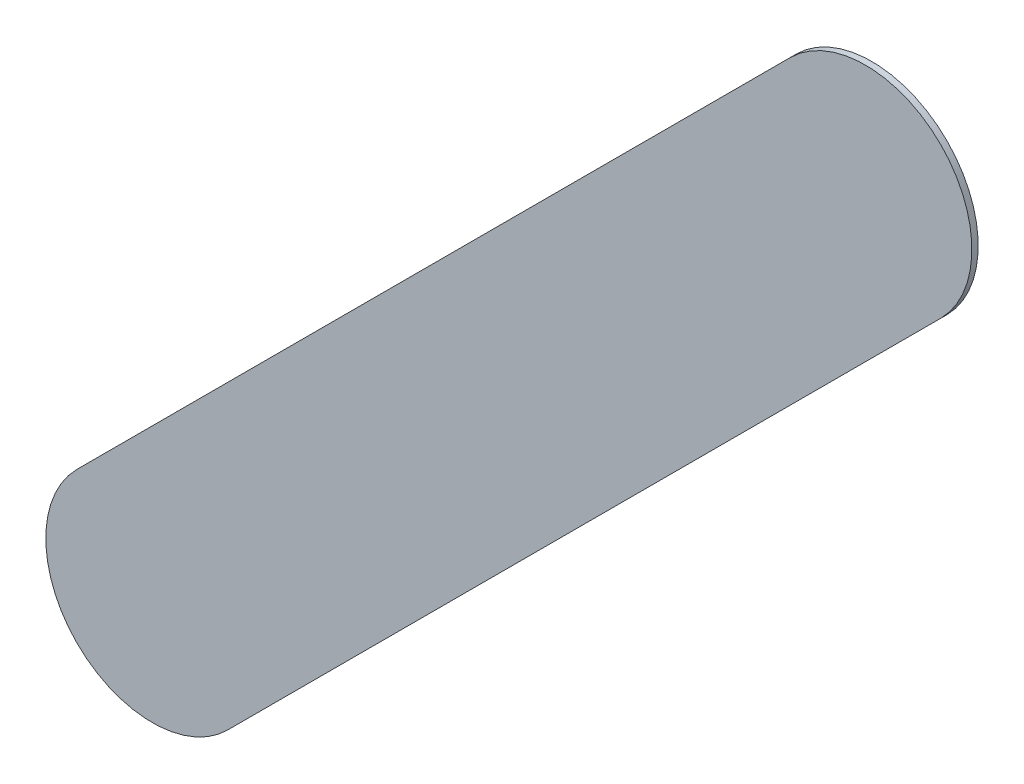
ISO-10303-21;
HEADER;
FILE_DESCRIPTION(('STEP AP214'),'2;1');
FILE_NAME('part.step','',(''),(''),'','','');
FILE_SCHEMA(('AUTOMOTIVE_DESIGN { 1 0 10303 214 1 1 1 1 }'));
ENDSEC;
DATA;
#1=APPLICATION_CONTEXT('core data for automotive mechanical design processes');
#2=APPLICATION_PROTOCOL_DEFINITION('international standard','automotive_design',2000,#1);
#3=PRODUCT_CONTEXT('',#1,'mechanical');
#4=PRODUCT('Part','Part','',(#3));
#5=PRODUCT_RELATED_PRODUCT_CATEGORY('part','',(#4));
#6=PRODUCT_DEFINITION_FORMATION('','',#4);
#7=PRODUCT_DEFINITION_CONTEXT('part definition',#1,'design');
#8=PRODUCT_DEFINITION('design','',#6,#7);
#9=PRODUCT_DEFINITION_SHAPE('','',#8);
#10=(LENGTH_UNIT() NAMED_UNIT(*) SI_UNIT(.MILLI.,.METRE.));
#11=(NAMED_UNIT(*) PLANE_ANGLE_UNIT() SI_UNIT($,.RADIAN.));
#12=(NAMED_UNIT(*) SI_UNIT($,.STERADIAN.) SOLID_ANGLE_UNIT());
#13=UNCERTAINTY_MEASURE_WITH_UNIT(LENGTH_MEASURE(1.E-05),#10,'distance_accuracy_value','');
#14=(GEOMETRIC_REPRESENTATION_CONTEXT(3) GLOBAL_UNCERTAINTY_ASSIGNED_CONTEXT((#13)) GLOBAL_UNIT_ASSIGNED_CONTEXT((#10,
#11,#12)) REPRESENTATION_CONTEXT('',''));
#15=CARTESIAN_POINT('',(0.,0.,0.));
#16=DIRECTION('',(0.,0.,1.));
#17=DIRECTION('',(1.,0.,0.));
#18=AXIS2_PLACEMENT_3D('',#15,#16,#17);
#19=CARTESIAN_POINT('',(51.28426878,50.57573578,0.));
#20=DIRECTION('',(-0.707106781186548,0.707106781186548,0.));
#21=DIRECTION('',(0.707106781186548,0.707106781186548,0.));
#22=AXIS2_PLACEMENT_3D('',#19,#20,#21);
#23=PLANE('',#22);
#24=DIRECTION('',(0.707106781186548,0.707106781186548,0.));
#25=VECTOR('',#24,1.);
#26=CARTESIAN_POINT('',(51.28426878,50.57573578,0.03556));
#27=LINE('',#26,#25);
#28=CARTESIAN_POINT('',(51.28426878,50.57573578,0.03556));
#29=VERTEX_POINT('',#28);
#30=CARTESIAN_POINT('',(55.30426582,54.59573282,0.03556));
#31=VERTEX_POINT('',#30);
#32=EDGE_CURVE('E11',#29,#31,#27,.T.);
#33=ORIENTED_EDGE('',*,*,#32,.F.);
#34=DIRECTION('',(0.,0.,1.));
#35=VECTOR('',#34,1.);
#36=CARTESIAN_POINT('',(51.28426878,50.57573578,0.));
#37=LINE('',#36,#35);
#38=CARTESIAN_POINT('',(51.28426878,50.57573578,0.));
#39=VERTEX_POINT('',#38);
#40=EDGE_CURVE('E24',#39,#29,#37,.T.);
#41=ORIENTED_EDGE('',*,*,#40,.F.);
#42=DIRECTION('',(0.707106781186548,0.707106781186548,0.));
#43=VECTOR('',#42,1.);
#44=CARTESIAN_POINT('',(51.28426878,50.57573578,0.));
#45=LINE('',#44,#43);
#46=CARTESIAN_POINT('',(55.30426582,54.59573282,0.));
#47=VERTEX_POINT('',#46);
#48=EDGE_CURVE('E75',#39,#47,#45,.T.);
#49=ORIENTED_EDGE('',*,*,#48,.T.);
#50=DIRECTION('',(0.,0.,1.));
#51=VECTOR('',#50,1.);
#52=CARTESIAN_POINT('',(55.30426582,54.59573282,0.));
#53=LINE('',#52,#51);
#54=EDGE_CURVE('E37',#47,#31,#53,.T.);
#55=ORIENTED_EDGE('',*,*,#54,.T.);
#56=EDGE_LOOP('',(#33,#41,#49,#55));
#57=FACE_BOUND('',#56,.T.);
#58=ADVANCED_FACE('F17',(#57),#23,.F.);
#59=CARTESIAN_POINT('',(54.880002,55.01999664,0.));
#60=DIRECTION('',(0.,0.,-1.));
#61=DIRECTION('',(0.707106781186548,-0.707106781186548,0.));
#62=AXIS2_PLACEMENT_3D('',#59,#60,#61);
#63=CYLINDRICAL_SURFACE('',#62,0.599999648268215);
#64=CARTESIAN_POINT('',(54.880002,55.01999664,0.03556));
#65=DIRECTION('',(0.,0.,1.));
#66=DIRECTION('',(0.707106781186548,-0.707106781186548,0.));
#67=AXIS2_PLACEMENT_3D('',#64,#65,#66);
#68=CIRCLE('',#67,0.599999648268215);
#69=CARTESIAN_POINT('',(54.45573818,55.44426046,0.03556));
#70=VERTEX_POINT('',#69);
#71=EDGE_CURVE('E83',#31,#70,#68,.T.);
#72=ORIENTED_EDGE('',*,*,#71,.F.);
#73=ORIENTED_EDGE('',*,*,#54,.F.);
#74=CARTESIAN_POINT('',(54.880002,55.01999664,0.));
#75=DIRECTION('',(0.,0.,1.));
#76=DIRECTION('',(0.707106781186548,-0.707106781186548,0.));
#77=AXIS2_PLACEMENT_3D('',#74,#75,#76);
#78=CIRCLE('',#77,0.599999648268215);
#79=CARTESIAN_POINT('',(54.45573818,55.44426046,0.));
#80=VERTEX_POINT('',#79);
#81=EDGE_CURVE('E81',#47,#80,#78,.T.);
#82=ORIENTED_EDGE('',*,*,#81,.T.);
#83=DIRECTION('',(0.,0.,1.));
#84=VECTOR('',#83,1.);
#85=CARTESIAN_POINT('',(54.45573818,55.44426046,0.));
#86=LINE('',#85,#84);
#87=EDGE_CURVE('E67',#80,#70,#86,.T.);
#88=ORIENTED_EDGE('',*,*,#87,.T.);
#89=EDGE_LOOP('',(#72,#73,#82,#88));
#90=FACE_BOUND('',#89,.T.);
#91=ADVANCED_FACE('F89',(#90),#63,.T.);
#92=CARTESIAN_POINT('',(54.45573818,55.44426046,0.));
#93=DIRECTION('',(0.707106781186548,-0.707106781186548,0.));
#94=DIRECTION('',(-0.707106781186548,-0.707106781186548,0.));
#95=AXIS2_PLACEMENT_3D('',#92,#93,#94);
#96=PLANE('',#95);
#97=DIRECTION('',(-0.707106781186548,-0.707106781186548,0.));
#98=VECTOR('',#97,1.);
#99=CARTESIAN_POINT('',(54.45573818,55.44426046,0.03556));
#100=LINE('',#99,#98);
#101=CARTESIAN_POINT('',(50.43574114,51.42426342,0.03556));
#102=VERTEX_POINT('',#101);
#103=EDGE_CURVE('E71',#70,#102,#100,.T.);
#104=ORIENTED_EDGE('',*,*,#103,.F.);
#105=ORIENTED_EDGE('',*,*,#87,.F.);
#106=DIRECTION('',(-0.707106781186548,-0.707106781186548,0.));
#107=VECTOR('',#106,1.);
#108=CARTESIAN_POINT('',(54.45573818,55.44426046,0.));
#109=LINE('',#108,#107);
#110=CARTESIAN_POINT('',(50.43574114,51.42426342,0.));
#111=VERTEX_POINT('',#110);
#112=EDGE_CURVE('E63',#80,#111,#109,.T.);
#113=ORIENTED_EDGE('',*,*,#112,.T.);
#114=DIRECTION('',(0.,0.,1.));
#115=VECTOR('',#114,1.);
#116=CARTESIAN_POINT('',(50.43574114,51.42426342,0.));
#117=LINE('',#116,#115);
#118=EDGE_CURVE('E53',#111,#102,#117,.T.);
#119=ORIENTED_EDGE('',*,*,#118,.T.);
#120=EDGE_LOOP('',(#104,#105,#113,#119));
#121=FACE_BOUND('',#120,.T.);
#122=ADVANCED_FACE('F66',(#121),#96,.F.);
#123=CARTESIAN_POINT('',(50.86000496,50.9999996,0.));
#124=DIRECTION('',(0.,0.,-1.));
#125=DIRECTION('',(-0.707106781186548,0.707106781186548,0.));
#126=AXIS2_PLACEMENT_3D('',#123,#124,#125);
#127=CYLINDRICAL_SURFACE('',#126,0.599999648268215);
#128=CARTESIAN_POINT('',(50.86000496,50.9999996,0.03556));
#129=DIRECTION('',(0.,0.,1.));
#130=DIRECTION('',(-0.707106781186548,0.707106781186548,0.));
#131=AXIS2_PLACEMENT_3D('',#128,#129,#130);
#132=CIRCLE('',#131,0.599999648268215);
#133=EDGE_CURVE('E59',#102,#29,#132,.T.);
#134=ORIENTED_EDGE('',*,*,#133,.F.);
#135=ORIENTED_EDGE('',*,*,#118,.F.);
#136=CARTESIAN_POINT('',(50.86000496,50.9999996,0.));
#137=DIRECTION('',(0.,0.,1.));
#138=DIRECTION('',(-0.707106781186548,0.707106781186548,0.));
#139=AXIS2_PLACEMENT_3D('',#136,#137,#138);
#140=CIRCLE('',#139,0.599999648268215);
#141=EDGE_CURVE('E57',#111,#39,#140,.T.);
#142=ORIENTED_EDGE('',*,*,#141,.T.);
#143=ORIENTED_EDGE('',*,*,#40,.T.);
#144=EDGE_LOOP('',(#134,#135,#142,#143));
#145=FACE_BOUND('',#144,.T.);
#146=ADVANCED_FACE('F55',(#145),#127,.T.);
#147=CARTESIAN_POINT('',(51.28426878,50.57573578,0.));
#148=DIRECTION('',(0.,0.,-1.));
#149=DIRECTION('',(-1.,0.,0.));
#150=AXIS2_PLACEMENT_3D('',#147,#148,#149);
#151=PLANE('',#150);
#152=ORIENTED_EDGE('',*,*,#141,.F.);
#153=ORIENTED_EDGE('',*,*,#112,.F.);
#154=ORIENTED_EDGE('',*,*,#81,.F.);
#155=ORIENTED_EDGE('',*,*,#48,.F.);
#156=EDGE_LOOP('',(#152,#153,#154,#155));
#157=FACE_BOUND('',#156,.T.);
#158=ADVANCED_FACE('F74',(#157),#151,.T.);
#159=CARTESIAN_POINT('',(51.28426878,50.57573578,0.03556));
#160=DIRECTION('',(0.,0.,-1.));
#161=DIRECTION('',(-1.,0.,0.));
#162=AXIS2_PLACEMENT_3D('',#159,#160,#161);
#163=PLANE('',#162);
#164=ORIENTED_EDGE('',*,*,#32,.T.);
#165=ORIENTED_EDGE('',*,*,#71,.T.);
#166=ORIENTED_EDGE('',*,*,#103,.T.);
#167=ORIENTED_EDGE('',*,*,#133,.T.);
#168=EDGE_LOOP('',(#164,#165,#166,#167));
#169=FACE_BOUND('',#168,.T.);
#170=ADVANCED_FACE('F91',(#169),#163,.F.);
#171=CLOSED_SHELL('',(#58,#91,#122,#146,#158,#170));
#172=MANIFOLD_SOLID_BREP('B1',#171);
#173=ADVANCED_BREP_SHAPE_REPRESENTATION('',(#18,#172),#14);
#174=SHAPE_DEFINITION_REPRESENTATION(#9,#173);
ENDSEC;
END-ISO-10303-21;
